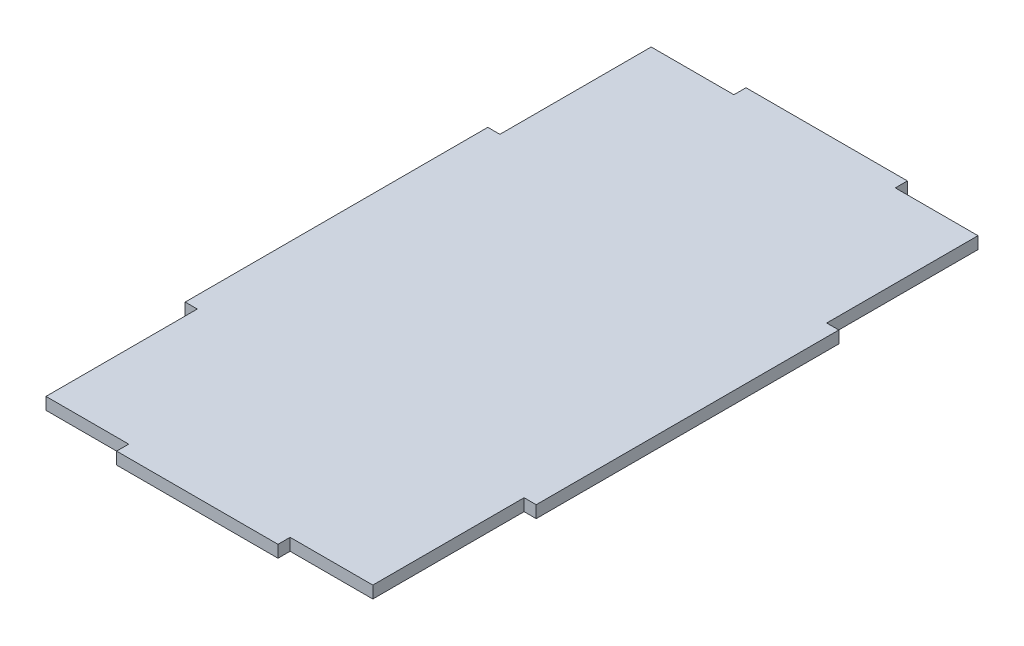
ISO-10303-21;
HEADER;
FILE_DESCRIPTION(('STEP AP214'),'2;1');
FILE_NAME('part.step','',(''),(''),'','','');
FILE_SCHEMA(('AUTOMOTIVE_DESIGN { 1 0 10303 214 1 1 1 1 }'));
ENDSEC;
DATA;
#1=APPLICATION_CONTEXT('core data for automotive mechanical design processes');
#2=APPLICATION_PROTOCOL_DEFINITION('international standard','automotive_design',2000,#1);
#3=PRODUCT_CONTEXT('',#1,'mechanical');
#4=PRODUCT('Part','Part','',(#3));
#5=PRODUCT_RELATED_PRODUCT_CATEGORY('part','',(#4));
#6=PRODUCT_DEFINITION_FORMATION('','',#4);
#7=PRODUCT_DEFINITION_CONTEXT('part definition',#1,'design');
#8=PRODUCT_DEFINITION('design','',#6,#7);
#9=PRODUCT_DEFINITION_SHAPE('','',#8);
#10=(LENGTH_UNIT() NAMED_UNIT(*) SI_UNIT(.MILLI.,.METRE.));
#11=(NAMED_UNIT(*) PLANE_ANGLE_UNIT() SI_UNIT($,.RADIAN.));
#12=(NAMED_UNIT(*) SI_UNIT($,.STERADIAN.) SOLID_ANGLE_UNIT());
#13=UNCERTAINTY_MEASURE_WITH_UNIT(LENGTH_MEASURE(1.E-05),#10,'distance_accuracy_value','');
#14=(GEOMETRIC_REPRESENTATION_CONTEXT(3) GLOBAL_UNCERTAINTY_ASSIGNED_CONTEXT((#13)) GLOBAL_UNIT_ASSIGNED_CONTEXT((#10,
#11,#12)) REPRESENTATION_CONTEXT('',''));
#15=CARTESIAN_POINT('',(0.,0.,0.));
#16=DIRECTION('',(0.,0.,1.));
#17=DIRECTION('',(1.,0.,0.));
#18=AXIS2_PLACEMENT_3D('',#15,#16,#17);
#19=CARTESIAN_POINT('',(0.,3.,0.));
#20=DIRECTION('',(1.,0.,0.));
#21=DIRECTION('',(0.,0.,-1.));
#22=AXIS2_PLACEMENT_3D('',#19,#20,#21);
#23=PLANE('',#22);
#24=DIRECTION('',(0.,0.,1.));
#25=VECTOR('',#24,1.);
#26=CARTESIAN_POINT('',(0.,0.,0.));
#27=LINE('',#26,#25);
#28=CARTESIAN_POINT('',(0.,0.,-37.5));
#29=VERTEX_POINT('',#28);
#30=CARTESIAN_POINT('',(0.,0.,0.));
#31=VERTEX_POINT('',#30);
#32=EDGE_CURVE('E212',#29,#31,#27,.T.);
#33=ORIENTED_EDGE('',*,*,#32,.T.);
#34=DIRECTION('',(0.,-1.,0.));
#35=VECTOR('',#34,1.);
#36=CARTESIAN_POINT('',(0.,3.,0.));
#37=LINE('',#36,#35);
#38=CARTESIAN_POINT('',(0.,3.,0.));
#39=VERTEX_POINT('',#38);
#40=EDGE_CURVE('E11',#39,#31,#37,.T.);
#41=ORIENTED_EDGE('',*,*,#40,.F.);
#42=DIRECTION('',(0.,0.,1.));
#43=VECTOR('',#42,1.);
#44=CARTESIAN_POINT('',(0.,3.,0.));
#45=LINE('',#44,#43);
#46=CARTESIAN_POINT('',(0.,3.,-37.5));
#47=VERTEX_POINT('',#46);
#48=EDGE_CURVE('E270',#47,#39,#45,.T.);
#49=ORIENTED_EDGE('',*,*,#48,.F.);
#50=DIRECTION('',(0.,-1.,0.));
#51=VECTOR('',#50,1.);
#52=CARTESIAN_POINT('',(0.,3.,-37.5));
#53=LINE('',#52,#51);
#54=EDGE_CURVE('E208',#47,#29,#53,.T.);
#55=ORIENTED_EDGE('',*,*,#54,.T.);
#56=EDGE_LOOP('',(#33,#41,#49,#55));
#57=FACE_BOUND('',#56,.T.);
#58=ADVANCED_FACE('F39',(#57),#23,.F.);
#59=CARTESIAN_POINT('',(0.,3.,0.));
#60=DIRECTION('',(0.,0.,-1.));
#61=DIRECTION('',(-1.,0.,0.));
#62=AXIS2_PLACEMENT_3D('',#59,#60,#61);
#63=PLANE('',#62);
#64=DIRECTION('',(1.,0.,0.));
#65=VECTOR('',#64,1.);
#66=CARTESIAN_POINT('',(0.,0.,0.));
#67=LINE('',#66,#65);
#68=CARTESIAN_POINT('',(20.5,0.,0.));
#69=VERTEX_POINT('',#68);
#70=EDGE_CURVE('E216',#31,#69,#67,.T.);
#71=ORIENTED_EDGE('',*,*,#70,.T.);
#72=DIRECTION('',(0.,-1.,0.));
#73=VECTOR('',#72,1.);
#74=CARTESIAN_POINT('',(20.5,3.,0.));
#75=LINE('',#74,#73);
#76=CARTESIAN_POINT('',(20.5,3.,0.));
#77=VERTEX_POINT('',#76);
#78=EDGE_CURVE('E48',#77,#69,#75,.T.);
#79=ORIENTED_EDGE('',*,*,#78,.F.);
#80=DIRECTION('',(1.,0.,0.));
#81=VECTOR('',#80,1.);
#82=CARTESIAN_POINT('',(0.,3.,0.));
#83=LINE('',#82,#81);
#84=EDGE_CURVE('E135',#39,#77,#83,.T.);
#85=ORIENTED_EDGE('',*,*,#84,.F.);
#86=ORIENTED_EDGE('',*,*,#40,.T.);
#87=EDGE_LOOP('',(#71,#79,#85,#86));
#88=FACE_BOUND('',#87,.T.);
#89=ADVANCED_FACE('F420',(#88),#63,.F.);
#90=CARTESIAN_POINT('',(20.5,3.,0.));
#91=DIRECTION('',(1.,0.,0.));
#92=DIRECTION('',(0.,0.,-1.));
#93=AXIS2_PLACEMENT_3D('',#90,#91,#92);
#94=PLANE('',#93);
#95=DIRECTION('',(0.,0.,1.));
#96=VECTOR('',#95,1.);
#97=CARTESIAN_POINT('',(20.5,0.,0.));
#98=LINE('',#97,#96);
#99=CARTESIAN_POINT('',(20.5,0.,3.));
#100=VERTEX_POINT('',#99);
#101=EDGE_CURVE('E219',#69,#100,#98,.T.);
#102=ORIENTED_EDGE('',*,*,#101,.T.);
#103=DIRECTION('',(0.,-1.,0.));
#104=VECTOR('',#103,1.);
#105=CARTESIAN_POINT('',(20.5,3.,3.));
#106=LINE('',#105,#104);
#107=CARTESIAN_POINT('',(20.5,3.,3.));
#108=VERTEX_POINT('',#107);
#109=EDGE_CURVE('E329',#108,#100,#106,.T.);
#110=ORIENTED_EDGE('',*,*,#109,.F.);
#111=DIRECTION('',(0.,0.,1.));
#112=VECTOR('',#111,1.);
#113=CARTESIAN_POINT('',(20.5,3.,0.));
#114=LINE('',#113,#112);
#115=EDGE_CURVE('E339',#77,#108,#114,.T.);
#116=ORIENTED_EDGE('',*,*,#115,.F.);
#117=ORIENTED_EDGE('',*,*,#78,.T.);
#118=EDGE_LOOP('',(#102,#110,#116,#117));
#119=FACE_BOUND('',#118,.T.);
#120=ADVANCED_FACE('F337',(#119),#94,.F.);
#121=CARTESIAN_POINT('',(20.5,3.,3.));
#122=DIRECTION('',(0.,0.,-1.));
#123=DIRECTION('',(-1.,0.,0.));
#124=AXIS2_PLACEMENT_3D('',#121,#122,#123);
#125=PLANE('',#124);
#126=DIRECTION('',(1.,0.,0.));
#127=VECTOR('',#126,1.);
#128=CARTESIAN_POINT('',(20.5,0.,3.));
#129=LINE('',#128,#127);
#130=CARTESIAN_POINT('',(60.5,0.,3.));
#131=VERTEX_POINT('',#130);
#132=EDGE_CURVE('E222',#100,#131,#129,.T.);
#133=ORIENTED_EDGE('',*,*,#132,.T.);
#134=DIRECTION('',(0.,-1.,0.));
#135=VECTOR('',#134,1.);
#136=CARTESIAN_POINT('',(60.5,3.,3.));
#137=LINE('',#136,#135);
#138=CARTESIAN_POINT('',(60.5,3.,3.));
#139=VERTEX_POINT('',#138);
#140=EDGE_CURVE('E325',#139,#131,#137,.T.);
#141=ORIENTED_EDGE('',*,*,#140,.F.);
#142=DIRECTION('',(1.,0.,0.));
#143=VECTOR('',#142,1.);
#144=CARTESIAN_POINT('',(20.5,3.,3.));
#145=LINE('',#144,#143);
#146=EDGE_CURVE('E358',#108,#139,#145,.T.);
#147=ORIENTED_EDGE('',*,*,#146,.F.);
#148=ORIENTED_EDGE('',*,*,#109,.T.);
#149=EDGE_LOOP('',(#133,#141,#147,#148));
#150=FACE_BOUND('',#149,.T.);
#151=ADVANCED_FACE('F348',(#150),#125,.F.);
#152=CARTESIAN_POINT('',(60.5,3.,0.));
#153=DIRECTION('',(-1.,0.,0.));
#154=DIRECTION('',(0.,0.,1.));
#155=AXIS2_PLACEMENT_3D('',#152,#153,#154);
#156=PLANE('',#155);
#157=DIRECTION('',(0.,0.,-1.));
#158=VECTOR('',#157,1.);
#159=CARTESIAN_POINT('',(60.5,0.,0.));
#160=LINE('',#159,#158);
#161=CARTESIAN_POINT('',(60.5,0.,0.));
#162=VERTEX_POINT('',#161);
#163=EDGE_CURVE('E225',#131,#162,#160,.T.);
#164=ORIENTED_EDGE('',*,*,#163,.T.);
#165=DIRECTION('',(0.,-1.,0.));
#166=VECTOR('',#165,1.);
#167=CARTESIAN_POINT('',(60.5,3.,0.));
#168=LINE('',#167,#166);
#169=CARTESIAN_POINT('',(60.5,3.,0.));
#170=VERTEX_POINT('',#169);
#171=EDGE_CURVE('E321',#170,#162,#168,.T.);
#172=ORIENTED_EDGE('',*,*,#171,.F.);
#173=DIRECTION('',(0.,0.,-1.));
#174=VECTOR('',#173,1.);
#175=CARTESIAN_POINT('',(60.5,3.,0.));
#176=LINE('',#175,#174);
#177=EDGE_CURVE('E354',#139,#170,#176,.T.);
#178=ORIENTED_EDGE('',*,*,#177,.F.);
#179=ORIENTED_EDGE('',*,*,#140,.T.);
#180=EDGE_LOOP('',(#164,#172,#178,#179));
#181=FACE_BOUND('',#180,.T.);
#182=ADVANCED_FACE('F352',(#181),#156,.F.);
#183=CARTESIAN_POINT('',(60.5,3.,0.));
#184=DIRECTION('',(0.,0.,-1.));
#185=DIRECTION('',(-1.,0.,0.));
#186=AXIS2_PLACEMENT_3D('',#183,#184,#185);
#187=PLANE('',#186);
#188=DIRECTION('',(1.,0.,0.));
#189=VECTOR('',#188,1.);
#190=CARTESIAN_POINT('',(60.5,0.,0.));
#191=LINE('',#190,#189);
#192=CARTESIAN_POINT('',(81.,0.,0.));
#193=VERTEX_POINT('',#192);
#194=EDGE_CURVE('E228',#162,#193,#191,.T.);
#195=ORIENTED_EDGE('',*,*,#194,.T.);
#196=DIRECTION('',(0.,-1.,0.));
#197=VECTOR('',#196,1.);
#198=CARTESIAN_POINT('',(81.,3.,0.));
#199=LINE('',#198,#197);
#200=CARTESIAN_POINT('',(81.,3.,0.));
#201=VERTEX_POINT('',#200);
#202=EDGE_CURVE('E317',#201,#193,#199,.T.);
#203=ORIENTED_EDGE('',*,*,#202,.F.);
#204=DIRECTION('',(1.,0.,0.));
#205=VECTOR('',#204,1.);
#206=CARTESIAN_POINT('',(60.5,3.,0.));
#207=LINE('',#206,#205);
#208=EDGE_CURVE('E357',#170,#201,#207,.T.);
#209=ORIENTED_EDGE('',*,*,#208,.F.);
#210=ORIENTED_EDGE('',*,*,#171,.T.);
#211=EDGE_LOOP('',(#195,#203,#209,#210));
#212=FACE_BOUND('',#211,.T.);
#213=ADVANCED_FACE('F433',(#212),#187,.F.);
#214=CARTESIAN_POINT('',(81.,3.,0.));
#215=DIRECTION('',(-1.,0.,0.));
#216=DIRECTION('',(0.,0.,1.));
#217=AXIS2_PLACEMENT_3D('',#214,#215,#216);
#218=PLANE('',#217);
#219=DIRECTION('',(0.,0.,-1.));
#220=VECTOR('',#219,1.);
#221=CARTESIAN_POINT('',(81.,0.,0.));
#222=LINE('',#221,#220);
#223=CARTESIAN_POINT('',(81.,0.,-37.5));
#224=VERTEX_POINT('',#223);
#225=EDGE_CURVE('E231',#193,#224,#222,.T.);
#226=ORIENTED_EDGE('',*,*,#225,.T.);
#227=DIRECTION('',(0.,-1.,0.));
#228=VECTOR('',#227,1.);
#229=CARTESIAN_POINT('',(81.,3.,-37.5));
#230=LINE('',#229,#228);
#231=CARTESIAN_POINT('',(81.,3.,-37.5));
#232=VERTEX_POINT('',#231);
#233=EDGE_CURVE('E313',#232,#224,#230,.T.);
#234=ORIENTED_EDGE('',*,*,#233,.F.);
#235=DIRECTION('',(0.,0.,-1.));
#236=VECTOR('',#235,1.);
#237=CARTESIAN_POINT('',(81.,3.,0.));
#238=LINE('',#237,#236);
#239=EDGE_CURVE('E362',#201,#232,#238,.T.);
#240=ORIENTED_EDGE('',*,*,#239,.F.);
#241=ORIENTED_EDGE('',*,*,#202,.T.);
#242=EDGE_LOOP('',(#226,#234,#240,#241));
#243=FACE_BOUND('',#242,.T.);
#244=ADVANCED_FACE('F436',(#243),#218,.F.);
#245=CARTESIAN_POINT('',(81.,3.,-37.5));
#246=DIRECTION('',(0.,0.,-1.));
#247=DIRECTION('',(-1.,0.,0.));
#248=AXIS2_PLACEMENT_3D('',#245,#246,#247);
#249=PLANE('',#248);
#250=DIRECTION('',(1.,0.,0.));
#251=VECTOR('',#250,1.);
#252=CARTESIAN_POINT('',(81.,0.,-37.5));
#253=LINE('',#252,#251);
#254=CARTESIAN_POINT('',(84.,0.,-37.5));
#255=VERTEX_POINT('',#254);
#256=EDGE_CURVE('E234',#224,#255,#253,.T.);
#257=ORIENTED_EDGE('',*,*,#256,.T.);
#258=DIRECTION('',(0.,-1.,0.));
#259=VECTOR('',#258,1.);
#260=CARTESIAN_POINT('',(84.,3.,-37.5));
#261=LINE('',#260,#259);
#262=CARTESIAN_POINT('',(84.,3.,-37.5));
#263=VERTEX_POINT('',#262);
#264=EDGE_CURVE('E309',#263,#255,#261,.T.);
#265=ORIENTED_EDGE('',*,*,#264,.F.);
#266=DIRECTION('',(1.,0.,0.));
#267=VECTOR('',#266,1.);
#268=CARTESIAN_POINT('',(81.,3.,-37.5));
#269=LINE('',#268,#267);
#270=EDGE_CURVE('E369',#232,#263,#269,.T.);
#271=ORIENTED_EDGE('',*,*,#270,.F.);
#272=ORIENTED_EDGE('',*,*,#233,.T.);
#273=EDGE_LOOP('',(#257,#265,#271,#272));
#274=FACE_BOUND('',#273,.T.);
#275=ADVANCED_FACE('F440',(#274),#249,.F.);
#276=CARTESIAN_POINT('',(84.,3.,-37.5));
#277=DIRECTION('',(-1.,0.,0.));
#278=DIRECTION('',(0.,0.,1.));
#279=AXIS2_PLACEMENT_3D('',#276,#277,#278);
#280=PLANE('',#279);
#281=DIRECTION('',(0.,0.,-1.));
#282=VECTOR('',#281,1.);
#283=CARTESIAN_POINT('',(84.,0.,-37.5));
#284=LINE('',#283,#282);
#285=CARTESIAN_POINT('',(84.,0.,-112.5));
#286=VERTEX_POINT('',#285);
#287=EDGE_CURVE('E237',#255,#286,#284,.T.);
#288=ORIENTED_EDGE('',*,*,#287,.T.);
#289=DIRECTION('',(0.,-1.,0.));
#290=VECTOR('',#289,1.);
#291=CARTESIAN_POINT('',(84.,3.,-112.5));
#292=LINE('',#291,#290);
#293=CARTESIAN_POINT('',(84.,3.,-112.5));
#294=VERTEX_POINT('',#293);
#295=EDGE_CURVE('E305',#294,#286,#292,.T.);
#296=ORIENTED_EDGE('',*,*,#295,.F.);
#297=DIRECTION('',(0.,0.,-1.));
#298=VECTOR('',#297,1.);
#299=CARTESIAN_POINT('',(84.,3.,-37.5));
#300=LINE('',#299,#298);
#301=EDGE_CURVE('E372',#263,#294,#300,.T.);
#302=ORIENTED_EDGE('',*,*,#301,.F.);
#303=ORIENTED_EDGE('',*,*,#264,.T.);
#304=EDGE_LOOP('',(#288,#296,#302,#303));
#305=FACE_BOUND('',#304,.T.);
#306=ADVANCED_FACE('F444',(#305),#280,.F.);
#307=CARTESIAN_POINT('',(81.,3.,-112.5));
#308=DIRECTION('',(0.,0.,1.));
#309=DIRECTION('',(1.,0.,0.));
#310=AXIS2_PLACEMENT_3D('',#307,#308,#309);
#311=PLANE('',#310);
#312=DIRECTION('',(-1.,0.,0.));
#313=VECTOR('',#312,1.);
#314=CARTESIAN_POINT('',(81.,0.,-112.5));
#315=LINE('',#314,#313);
#316=CARTESIAN_POINT('',(81.,0.,-112.5));
#317=VERTEX_POINT('',#316);
#318=EDGE_CURVE('E240',#286,#317,#315,.T.);
#319=ORIENTED_EDGE('',*,*,#318,.T.);
#320=DIRECTION('',(0.,-1.,0.));
#321=VECTOR('',#320,1.);
#322=CARTESIAN_POINT('',(81.,3.,-112.5));
#323=LINE('',#322,#321);
#324=CARTESIAN_POINT('',(81.,3.,-112.5));
#325=VERTEX_POINT('',#324);
#326=EDGE_CURVE('E301',#325,#317,#323,.T.);
#327=ORIENTED_EDGE('',*,*,#326,.F.);
#328=DIRECTION('',(-1.,0.,0.));
#329=VECTOR('',#328,1.);
#330=CARTESIAN_POINT('',(81.,3.,-112.5));
#331=LINE('',#330,#329);
#332=EDGE_CURVE('E375',#294,#325,#331,.T.);
#333=ORIENTED_EDGE('',*,*,#332,.F.);
#334=ORIENTED_EDGE('',*,*,#295,.T.);
#335=EDGE_LOOP('',(#319,#327,#333,#334));
#336=FACE_BOUND('',#335,.T.);
#337=ADVANCED_FACE('F448',(#336),#311,.F.);
#338=CARTESIAN_POINT('',(81.,3.,-112.5));
#339=DIRECTION('',(-1.,0.,0.));
#340=DIRECTION('',(0.,0.,1.));
#341=AXIS2_PLACEMENT_3D('',#338,#339,#340);
#342=PLANE('',#341);
#343=DIRECTION('',(0.,0.,-1.));
#344=VECTOR('',#343,1.);
#345=CARTESIAN_POINT('',(81.,0.,-112.5));
#346=LINE('',#345,#344);
#347=CARTESIAN_POINT('',(81.,0.,-150.));
#348=VERTEX_POINT('',#347);
#349=EDGE_CURVE('E243',#317,#348,#346,.T.);
#350=ORIENTED_EDGE('',*,*,#349,.T.);
#351=DIRECTION('',(0.,-1.,0.));
#352=VECTOR('',#351,1.);
#353=CARTESIAN_POINT('',(81.,3.,-150.));
#354=LINE('',#353,#352);
#355=CARTESIAN_POINT('',(81.,3.,-150.));
#356=VERTEX_POINT('',#355);
#357=EDGE_CURVE('E297',#356,#348,#354,.T.);
#358=ORIENTED_EDGE('',*,*,#357,.F.);
#359=DIRECTION('',(0.,0.,-1.));
#360=VECTOR('',#359,1.);
#361=CARTESIAN_POINT('',(81.,3.,-112.5));
#362=LINE('',#361,#360);
#363=EDGE_CURVE('E378',#325,#356,#362,.T.);
#364=ORIENTED_EDGE('',*,*,#363,.F.);
#365=ORIENTED_EDGE('',*,*,#326,.T.);
#366=EDGE_LOOP('',(#350,#358,#364,#365));
#367=FACE_BOUND('',#366,.T.);
#368=ADVANCED_FACE('F452',(#367),#342,.F.);
#369=CARTESIAN_POINT('',(60.5,3.,-150.));
#370=DIRECTION('',(0.,0.,1.));
#371=DIRECTION('',(1.,0.,0.));
#372=AXIS2_PLACEMENT_3D('',#369,#370,#371);
#373=PLANE('',#372);
#374=DIRECTION('',(-1.,0.,0.));
#375=VECTOR('',#374,1.);
#376=CARTESIAN_POINT('',(60.5,0.,-150.));
#377=LINE('',#376,#375);
#378=CARTESIAN_POINT('',(60.5,0.,-150.));
#379=VERTEX_POINT('',#378);
#380=EDGE_CURVE('E246',#348,#379,#377,.T.);
#381=ORIENTED_EDGE('',*,*,#380,.T.);
#382=DIRECTION('',(0.,-1.,0.));
#383=VECTOR('',#382,1.);
#384=CARTESIAN_POINT('',(60.5,3.,-150.));
#385=LINE('',#384,#383);
#386=CARTESIAN_POINT('',(60.5,3.,-150.));
#387=VERTEX_POINT('',#386);
#388=EDGE_CURVE('E293',#387,#379,#385,.T.);
#389=ORIENTED_EDGE('',*,*,#388,.F.);
#390=DIRECTION('',(-1.,0.,0.));
#391=VECTOR('',#390,1.);
#392=CARTESIAN_POINT('',(60.5,3.,-150.));
#393=LINE('',#392,#391);
#394=EDGE_CURVE('E381',#356,#387,#393,.T.);
#395=ORIENTED_EDGE('',*,*,#394,.F.);
#396=ORIENTED_EDGE('',*,*,#357,.T.);
#397=EDGE_LOOP('',(#381,#389,#395,#396));
#398=FACE_BOUND('',#397,.T.);
#399=ADVANCED_FACE('F456',(#398),#373,.F.);
#400=CARTESIAN_POINT('',(60.5,3.,-150.));
#401=DIRECTION('',(-1.,0.,0.));
#402=DIRECTION('',(0.,0.,1.));
#403=AXIS2_PLACEMENT_3D('',#400,#401,#402);
#404=PLANE('',#403);
#405=DIRECTION('',(0.,0.,-1.));
#406=VECTOR('',#405,1.);
#407=CARTESIAN_POINT('',(60.5,0.,-150.));
#408=LINE('',#407,#406);
#409=CARTESIAN_POINT('',(60.5,0.,-153.));
#410=VERTEX_POINT('',#409);
#411=EDGE_CURVE('E249',#379,#410,#408,.T.);
#412=ORIENTED_EDGE('',*,*,#411,.T.);
#413=DIRECTION('',(0.,-1.,0.));
#414=VECTOR('',#413,1.);
#415=CARTESIAN_POINT('',(60.5,3.,-153.));
#416=LINE('',#415,#414);
#417=CARTESIAN_POINT('',(60.5,3.,-153.));
#418=VERTEX_POINT('',#417);
#419=EDGE_CURVE('E289',#418,#410,#416,.T.);
#420=ORIENTED_EDGE('',*,*,#419,.F.);
#421=DIRECTION('',(0.,0.,-1.));
#422=VECTOR('',#421,1.);
#423=CARTESIAN_POINT('',(60.5,3.,-150.));
#424=LINE('',#423,#422);
#425=EDGE_CURVE('E384',#387,#418,#424,.T.);
#426=ORIENTED_EDGE('',*,*,#425,.F.);
#427=ORIENTED_EDGE('',*,*,#388,.T.);
#428=EDGE_LOOP('',(#412,#420,#426,#427));
#429=FACE_BOUND('',#428,.T.);
#430=ADVANCED_FACE('F460',(#429),#404,.F.);
#431=CARTESIAN_POINT('',(20.5,3.,-153.));
#432=DIRECTION('',(0.,0.,1.));
#433=DIRECTION('',(1.,0.,0.));
#434=AXIS2_PLACEMENT_3D('',#431,#432,#433);
#435=PLANE('',#434);
#436=DIRECTION('',(-1.,0.,0.));
#437=VECTOR('',#436,1.);
#438=CARTESIAN_POINT('',(20.5,0.,-153.));
#439=LINE('',#438,#437);
#440=CARTESIAN_POINT('',(20.5,0.,-153.));
#441=VERTEX_POINT('',#440);
#442=EDGE_CURVE('E252',#410,#441,#439,.T.);
#443=ORIENTED_EDGE('',*,*,#442,.T.);
#444=DIRECTION('',(0.,-1.,0.));
#445=VECTOR('',#444,1.);
#446=CARTESIAN_POINT('',(20.5,3.,-153.));
#447=LINE('',#446,#445);
#448=CARTESIAN_POINT('',(20.5,3.,-153.));
#449=VERTEX_POINT('',#448);
#450=EDGE_CURVE('E285',#449,#441,#447,.T.);
#451=ORIENTED_EDGE('',*,*,#450,.F.);
#452=DIRECTION('',(-1.,0.,0.));
#453=VECTOR('',#452,1.);
#454=CARTESIAN_POINT('',(20.5,3.,-153.));
#455=LINE('',#454,#453);
#456=EDGE_CURVE('E387',#418,#449,#455,.T.);
#457=ORIENTED_EDGE('',*,*,#456,.F.);
#458=ORIENTED_EDGE('',*,*,#419,.T.);
#459=EDGE_LOOP('',(#443,#451,#457,#458));
#460=FACE_BOUND('',#459,.T.);
#461=ADVANCED_FACE('F464',(#460),#435,.F.);
#462=CARTESIAN_POINT('',(20.5,3.,-150.));
#463=DIRECTION('',(1.,0.,0.));
#464=DIRECTION('',(0.,0.,-1.));
#465=AXIS2_PLACEMENT_3D('',#462,#463,#464);
#466=PLANE('',#465);
#467=DIRECTION('',(0.,0.,1.));
#468=VECTOR('',#467,1.);
#469=CARTESIAN_POINT('',(20.5,0.,-150.));
#470=LINE('',#469,#468);
#471=CARTESIAN_POINT('',(20.5,0.,-150.));
#472=VERTEX_POINT('',#471);
#473=EDGE_CURVE('E255',#441,#472,#470,.T.);
#474=ORIENTED_EDGE('',*,*,#473,.T.);
#475=DIRECTION('',(0.,-1.,0.));
#476=VECTOR('',#475,1.);
#477=CARTESIAN_POINT('',(20.5,3.,-150.));
#478=LINE('',#477,#476);
#479=CARTESIAN_POINT('',(20.5,3.,-150.));
#480=VERTEX_POINT('',#479);
#481=EDGE_CURVE('E281',#480,#472,#478,.T.);
#482=ORIENTED_EDGE('',*,*,#481,.F.);
#483=DIRECTION('',(0.,0.,1.));
#484=VECTOR('',#483,1.);
#485=CARTESIAN_POINT('',(20.5,3.,-150.));
#486=LINE('',#485,#484);
#487=EDGE_CURVE('E390',#449,#480,#486,.T.);
#488=ORIENTED_EDGE('',*,*,#487,.F.);
#489=ORIENTED_EDGE('',*,*,#450,.T.);
#490=EDGE_LOOP('',(#474,#482,#488,#489));
#491=FACE_BOUND('',#490,.T.);
#492=ADVANCED_FACE('F468',(#491),#466,.F.);
#493=CARTESIAN_POINT('',(0.,3.,-150.));
#494=DIRECTION('',(0.,0.,1.));
#495=DIRECTION('',(1.,0.,0.));
#496=AXIS2_PLACEMENT_3D('',#493,#494,#495);
#497=PLANE('',#496);
#498=DIRECTION('',(-1.,0.,0.));
#499=VECTOR('',#498,1.);
#500=CARTESIAN_POINT('',(0.,0.,-150.));
#501=LINE('',#500,#499);
#502=CARTESIAN_POINT('',(0.,0.,-150.));
#503=VERTEX_POINT('',#502);
#504=EDGE_CURVE('E258',#472,#503,#501,.T.);
#505=ORIENTED_EDGE('',*,*,#504,.T.);
#506=DIRECTION('',(0.,-1.,0.));
#507=VECTOR('',#506,1.);
#508=CARTESIAN_POINT('',(0.,3.,-150.));
#509=LINE('',#508,#507);
#510=CARTESIAN_POINT('',(0.,3.,-150.));
#511=VERTEX_POINT('',#510);
#512=EDGE_CURVE('E277',#511,#503,#509,.T.);
#513=ORIENTED_EDGE('',*,*,#512,.F.);
#514=DIRECTION('',(-1.,0.,0.));
#515=VECTOR('',#514,1.);
#516=CARTESIAN_POINT('',(0.,3.,-150.));
#517=LINE('',#516,#515);
#518=EDGE_CURVE('E393',#480,#511,#517,.T.);
#519=ORIENTED_EDGE('',*,*,#518,.F.);
#520=ORIENTED_EDGE('',*,*,#481,.T.);
#521=EDGE_LOOP('',(#505,#513,#519,#520));
#522=FACE_BOUND('',#521,.T.);
#523=ADVANCED_FACE('F401',(#522),#497,.F.);
#524=CARTESIAN_POINT('',(0.,3.,-112.5));
#525=DIRECTION('',(1.,0.,0.));
#526=DIRECTION('',(0.,0.,-1.));
#527=AXIS2_PLACEMENT_3D('',#524,#525,#526);
#528=PLANE('',#527);
#529=DIRECTION('',(0.,0.,1.));
#530=VECTOR('',#529,1.);
#531=CARTESIAN_POINT('',(0.,0.,-112.5));
#532=LINE('',#531,#530);
#533=CARTESIAN_POINT('',(0.,0.,-112.5));
#534=VERTEX_POINT('',#533);
#535=EDGE_CURVE('E261',#503,#534,#532,.T.);
#536=ORIENTED_EDGE('',*,*,#535,.T.);
#537=DIRECTION('',(0.,-1.,0.));
#538=VECTOR('',#537,1.);
#539=CARTESIAN_POINT('',(0.,3.,-112.5));
#540=LINE('',#539,#538);
#541=CARTESIAN_POINT('',(0.,3.,-112.5));
#542=VERTEX_POINT('',#541);
#543=EDGE_CURVE('E201',#542,#534,#540,.T.);
#544=ORIENTED_EDGE('',*,*,#543,.F.);
#545=DIRECTION('',(0.,0.,1.));
#546=VECTOR('',#545,1.);
#547=CARTESIAN_POINT('',(0.,3.,-112.5));
#548=LINE('',#547,#546);
#549=EDGE_CURVE('E190',#511,#542,#548,.T.);
#550=ORIENTED_EDGE('',*,*,#549,.F.);
#551=ORIENTED_EDGE('',*,*,#512,.T.);
#552=EDGE_LOOP('',(#536,#544,#550,#551));
#553=FACE_BOUND('',#552,.T.);
#554=ADVANCED_FACE('F405',(#553),#528,.F.);
#555=CARTESIAN_POINT('',(0.,3.,-112.5));
#556=DIRECTION('',(0.,0.,1.));
#557=DIRECTION('',(1.,0.,0.));
#558=AXIS2_PLACEMENT_3D('',#555,#556,#557);
#559=PLANE('',#558);
#560=DIRECTION('',(-1.,0.,0.));
#561=VECTOR('',#560,1.);
#562=CARTESIAN_POINT('',(0.,0.,-112.5));
#563=LINE('',#562,#561);
#564=CARTESIAN_POINT('',(-3.,0.,-112.5));
#565=VERTEX_POINT('',#564);
#566=EDGE_CURVE('E199',#534,#565,#563,.T.);
#567=ORIENTED_EDGE('',*,*,#566,.T.);
#568=DIRECTION('',(0.,-1.,0.));
#569=VECTOR('',#568,1.);
#570=CARTESIAN_POINT('',(-3.,3.,-112.5));
#571=LINE('',#570,#569);
#572=CARTESIAN_POINT('',(-3.,3.,-112.5));
#573=VERTEX_POINT('',#572);
#574=EDGE_CURVE('E196',#573,#565,#571,.T.);
#575=ORIENTED_EDGE('',*,*,#574,.F.);
#576=DIRECTION('',(-1.,0.,0.));
#577=VECTOR('',#576,1.);
#578=CARTESIAN_POINT('',(0.,3.,-112.5));
#579=LINE('',#578,#577);
#580=EDGE_CURVE('E184',#542,#573,#579,.T.);
#581=ORIENTED_EDGE('',*,*,#580,.F.);
#582=ORIENTED_EDGE('',*,*,#543,.T.);
#583=EDGE_LOOP('',(#567,#575,#581,#582));
#584=FACE_BOUND('',#583,.T.);
#585=ADVANCED_FACE('F197',(#584),#559,.F.);
#586=CARTESIAN_POINT('',(-3.,3.,-37.5));
#587=DIRECTION('',(1.,0.,0.));
#588=DIRECTION('',(0.,0.,-1.));
#589=AXIS2_PLACEMENT_3D('',#586,#587,#588);
#590=PLANE('',#589);
#591=DIRECTION('',(0.,0.,1.));
#592=VECTOR('',#591,1.);
#593=CARTESIAN_POINT('',(-3.,0.,-37.5));
#594=LINE('',#593,#592);
#595=CARTESIAN_POINT('',(-3.,0.,-37.5));
#596=VERTEX_POINT('',#595);
#597=EDGE_CURVE('E121',#565,#596,#594,.T.);
#598=ORIENTED_EDGE('',*,*,#597,.T.);
#599=DIRECTION('',(0.,-1.,0.));
#600=VECTOR('',#599,1.);
#601=CARTESIAN_POINT('',(-3.,3.,-37.5));
#602=LINE('',#601,#600);
#603=CARTESIAN_POINT('',(-3.,3.,-37.5));
#604=VERTEX_POINT('',#603);
#605=EDGE_CURVE('E202',#604,#596,#602,.T.);
#606=ORIENTED_EDGE('',*,*,#605,.F.);
#607=DIRECTION('',(0.,0.,1.));
#608=VECTOR('',#607,1.);
#609=CARTESIAN_POINT('',(-3.,3.,-37.5));
#610=LINE('',#609,#608);
#611=EDGE_CURVE('E188',#573,#604,#610,.T.);
#612=ORIENTED_EDGE('',*,*,#611,.F.);
#613=ORIENTED_EDGE('',*,*,#574,.T.);
#614=EDGE_LOOP('',(#598,#606,#612,#613));
#615=FACE_BOUND('',#614,.T.);
#616=ADVANCED_FACE('F204',(#615),#590,.F.);
#617=CARTESIAN_POINT('',(0.,3.,-37.5));
#618=DIRECTION('',(0.,0.,-1.));
#619=DIRECTION('',(-1.,0.,0.));
#620=AXIS2_PLACEMENT_3D('',#617,#618,#619);
#621=PLANE('',#620);
#622=DIRECTION('',(1.,0.,0.));
#623=VECTOR('',#622,1.);
#624=CARTESIAN_POINT('',(0.,0.,-37.5));
#625=LINE('',#624,#623);
#626=EDGE_CURVE('E127',#596,#29,#625,.T.);
#627=ORIENTED_EDGE('',*,*,#626,.T.);
#628=ORIENTED_EDGE('',*,*,#54,.F.);
#629=DIRECTION('',(1.,0.,0.));
#630=VECTOR('',#629,1.);
#631=CARTESIAN_POINT('',(0.,3.,-37.5));
#632=LINE('',#631,#630);
#633=EDGE_CURVE('E56',#604,#47,#632,.T.);
#634=ORIENTED_EDGE('',*,*,#633,.F.);
#635=ORIENTED_EDGE('',*,*,#605,.T.);
#636=EDGE_LOOP('',(#627,#628,#634,#635));
#637=FACE_BOUND('',#636,.T.);
#638=ADVANCED_FACE('F409',(#637),#621,.F.);
#639=CARTESIAN_POINT('',(0.,3.,0.));
#640=DIRECTION('',(0.,1.,0.));
#641=DIRECTION('',(0.,0.,1.));
#642=AXIS2_PLACEMENT_3D('',#639,#640,#641);
#643=PLANE('',#642);
#644=ORIENTED_EDGE('',*,*,#48,.T.);
#645=ORIENTED_EDGE('',*,*,#84,.T.);
#646=ORIENTED_EDGE('',*,*,#115,.T.);
#647=ORIENTED_EDGE('',*,*,#146,.T.);
#648=ORIENTED_EDGE('',*,*,#177,.T.);
#649=ORIENTED_EDGE('',*,*,#208,.T.);
#650=ORIENTED_EDGE('',*,*,#239,.T.);
#651=ORIENTED_EDGE('',*,*,#270,.T.);
#652=ORIENTED_EDGE('',*,*,#301,.T.);
#653=ORIENTED_EDGE('',*,*,#332,.T.);
#654=ORIENTED_EDGE('',*,*,#363,.T.);
#655=ORIENTED_EDGE('',*,*,#394,.T.);
#656=ORIENTED_EDGE('',*,*,#425,.T.);
#657=ORIENTED_EDGE('',*,*,#456,.T.);
#658=ORIENTED_EDGE('',*,*,#487,.T.);
#659=ORIENTED_EDGE('',*,*,#518,.T.);
#660=ORIENTED_EDGE('',*,*,#549,.T.);
#661=ORIENTED_EDGE('',*,*,#580,.T.);
#662=ORIENTED_EDGE('',*,*,#611,.T.);
#663=ORIENTED_EDGE('',*,*,#633,.T.);
#664=EDGE_LOOP('',(#644,#645,#646,#647,#648,#649,#650,#651,#652,#653,#654,#655,#656,#657,#658,
#659,#660,#661,#662,#663));
#665=FACE_BOUND('',#664,.T.);
#666=ADVANCED_FACE('F186',(#665),#643,.T.);
#667=CARTESIAN_POINT('',(0.,0.,0.));
#668=DIRECTION('',(0.,1.,0.));
#669=DIRECTION('',(0.,0.,1.));
#670=AXIS2_PLACEMENT_3D('',#667,#668,#669);
#671=PLANE('',#670);
#672=ORIENTED_EDGE('',*,*,#32,.F.);
#673=ORIENTED_EDGE('',*,*,#626,.F.);
#674=ORIENTED_EDGE('',*,*,#597,.F.);
#675=ORIENTED_EDGE('',*,*,#566,.F.);
#676=ORIENTED_EDGE('',*,*,#535,.F.);
#677=ORIENTED_EDGE('',*,*,#504,.F.);
#678=ORIENTED_EDGE('',*,*,#473,.F.);
#679=ORIENTED_EDGE('',*,*,#442,.F.);
#680=ORIENTED_EDGE('',*,*,#411,.F.);
#681=ORIENTED_EDGE('',*,*,#380,.F.);
#682=ORIENTED_EDGE('',*,*,#349,.F.);
#683=ORIENTED_EDGE('',*,*,#318,.F.);
#684=ORIENTED_EDGE('',*,*,#287,.F.);
#685=ORIENTED_EDGE('',*,*,#256,.F.);
#686=ORIENTED_EDGE('',*,*,#225,.F.);
#687=ORIENTED_EDGE('',*,*,#194,.F.);
#688=ORIENTED_EDGE('',*,*,#163,.F.);
#689=ORIENTED_EDGE('',*,*,#132,.F.);
#690=ORIENTED_EDGE('',*,*,#101,.F.);
#691=ORIENTED_EDGE('',*,*,#70,.F.);
#692=EDGE_LOOP('',(#672,#673,#674,#675,#676,#677,#678,#679,#680,#681,#682,#683,#684,#685,#686,
#687,#688,#689,#690,#691));
#693=FACE_BOUND('',#692,.T.);
#694=ADVANCED_FACE('F343',(#693),#671,.F.);
#695=CLOSED_SHELL('',(#58,#89,#120,#151,#182,#213,#244,#275,#306,#337,#368,#399,#430,#461,#492,
#523,#554,#585,#616,#638,#666,#694));
#696=MANIFOLD_SOLID_BREP('B2',#695);
#697=ADVANCED_BREP_SHAPE_REPRESENTATION('',(#18,#696),#14);
#698=SHAPE_DEFINITION_REPRESENTATION(#9,#697);
ENDSEC;
END-ISO-10303-21;
